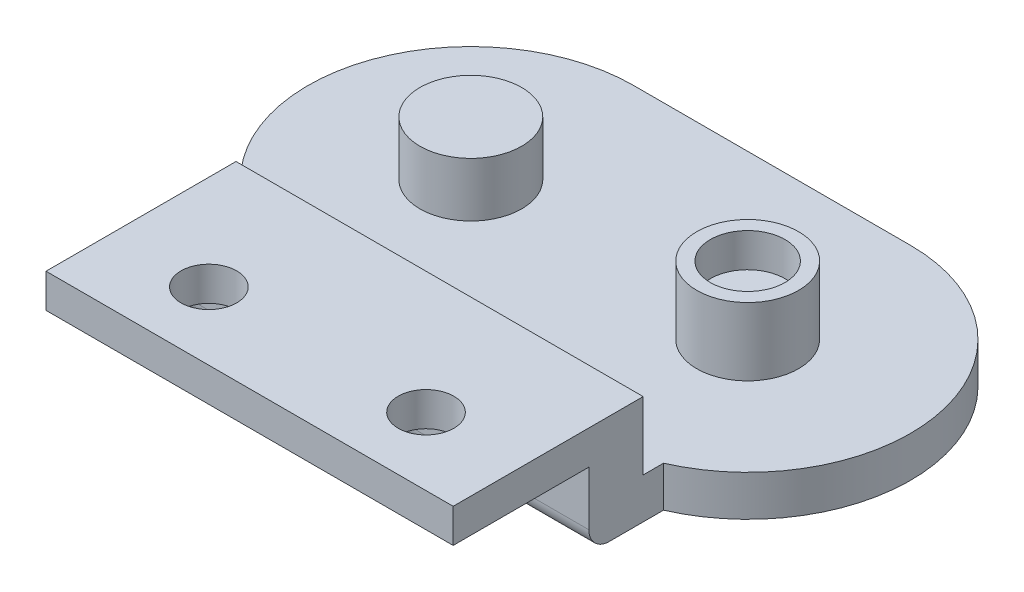
ISO-10303-21;
HEADER;
FILE_DESCRIPTION(('STEP AP214'),'2;1');
FILE_NAME('part.step','',(''),(''),'','','');
FILE_SCHEMA(('AUTOMOTIVE_DESIGN { 1 0 10303 214 1 1 1 1 }'));
ENDSEC;
DATA;
#1=APPLICATION_CONTEXT('core data for automotive mechanical design processes');
#2=APPLICATION_PROTOCOL_DEFINITION('international standard','automotive_design',2000,#1);
#3=PRODUCT_CONTEXT('',#1,'mechanical');
#4=PRODUCT('Part','Part','',(#3));
#5=PRODUCT_RELATED_PRODUCT_CATEGORY('part','',(#4));
#6=PRODUCT_DEFINITION_FORMATION('','',#4);
#7=PRODUCT_DEFINITION_CONTEXT('part definition',#1,'design');
#8=PRODUCT_DEFINITION('design','',#6,#7);
#9=PRODUCT_DEFINITION_SHAPE('','',#8);
#10=(LENGTH_UNIT() NAMED_UNIT(*) SI_UNIT(.MILLI.,.METRE.));
#11=(NAMED_UNIT(*) PLANE_ANGLE_UNIT() SI_UNIT($,.RADIAN.));
#12=(NAMED_UNIT(*) SI_UNIT($,.STERADIAN.) SOLID_ANGLE_UNIT());
#13=UNCERTAINTY_MEASURE_WITH_UNIT(LENGTH_MEASURE(1.E-05),#10,'distance_accuracy_value','');
#14=(GEOMETRIC_REPRESENTATION_CONTEXT(3) GLOBAL_UNCERTAINTY_ASSIGNED_CONTEXT((#13)) GLOBAL_UNIT_ASSIGNED_CONTEXT((#10,
#11,#12)) REPRESENTATION_CONTEXT('',''));
#15=CARTESIAN_POINT('',(0.,0.,0.));
#16=DIRECTION('',(0.,0.,1.));
#17=DIRECTION('',(1.,0.,0.));
#18=AXIS2_PLACEMENT_3D('',#15,#16,#17);
#19=CARTESIAN_POINT('',(0.,8.,0.));
#20=DIRECTION('',(0.,1.,0.));
#21=DIRECTION('',(0.,0.,1.));
#22=AXIS2_PLACEMENT_3D('',#19,#20,#21);
#23=PLANE('',#22);
#24=DIRECTION('',(1.,0.,0.));
#25=VECTOR('',#24,1.);
#26=CARTESIAN_POINT('',(0.,8.,12.5));
#27=LINE('',#26,#25);
#28=CARTESIAN_POINT('',(-15.,8.,12.5));
#29=VERTEX_POINT('',#28);
#30=CARTESIAN_POINT('',(15.,8.,12.5));
#31=VERTEX_POINT('',#30);
#32=EDGE_CURVE('E148',#29,#31,#27,.T.);
#33=ORIENTED_EDGE('',*,*,#32,.F.);
#34=DIRECTION('',(0.,0.,1.));
#35=VECTOR('',#34,1.);
#36=CARTESIAN_POINT('',(-15.,8.,0.));
#37=LINE('',#36,#35);
#38=CARTESIAN_POINT('',(-15.,8.,26.5));
#39=VERTEX_POINT('',#38);
#40=EDGE_CURVE('E155',#29,#39,#37,.T.);
#41=ORIENTED_EDGE('',*,*,#40,.T.);
#42=DIRECTION('',(-1.,0.,0.));
#43=VECTOR('',#42,1.);
#44=CARTESIAN_POINT('',(0.,8.,26.5));
#45=LINE('',#44,#43);
#46=CARTESIAN_POINT('',(15.,8.,26.5));
#47=VERTEX_POINT('',#46);
#48=EDGE_CURVE('E136',#47,#39,#45,.T.);
#49=ORIENTED_EDGE('',*,*,#48,.F.);
#50=DIRECTION('',(0.,0.,-1.));
#51=VECTOR('',#50,1.);
#52=CARTESIAN_POINT('',(15.,8.,0.));
#53=LINE('',#52,#51);
#54=EDGE_CURVE('E157',#47,#31,#53,.T.);
#55=ORIENTED_EDGE('',*,*,#54,.T.);
#56=EDGE_LOOP('',(#33,#41,#49,#55));
#57=FACE_BOUND('',#56,.T.);
#58=CARTESIAN_POINT('',(-8.,8.,21.5));
#59=DIRECTION('',(0.,1.,0.));
#60=DIRECTION('',(0.,0.,1.));
#61=AXIS2_PLACEMENT_3D('',#58,#59,#60);
#62=CIRCLE('',#61,2.05);
#63=CARTESIAN_POINT('',(-8.,8.,23.55));
#64=VERTEX_POINT('',#63);
#65=EDGE_CURVE('E228',#64,#64,#62,.T.);
#66=ORIENTED_EDGE('',*,*,#65,.F.);
#67=EDGE_LOOP('',(#66));
#68=FACE_BOUND('',#67,.T.);
#69=CARTESIAN_POINT('',(8.,8.,21.5));
#70=DIRECTION('',(0.,1.,0.));
#71=DIRECTION('',(0.,0.,1.));
#72=AXIS2_PLACEMENT_3D('',#69,#70,#71);
#73=CIRCLE('',#72,2.05);
#74=CARTESIAN_POINT('',(8.,8.,23.55));
#75=VERTEX_POINT('',#74);
#76=EDGE_CURVE('E213',#75,#75,#73,.F.);
#77=ORIENTED_EDGE('',*,*,#76,.T.);
#78=EDGE_LOOP('',(#77));
#79=FACE_BOUND('',#78,.T.);
#80=ADVANCED_FACE('F36',(#57,#68,#79),#23,.T.);
#81=CARTESIAN_POINT('',(0.,5.5,26.5));
#82=DIRECTION('',(0.,1.,0.));
#83=DIRECTION('',(0.,0.,1.));
#84=AXIS2_PLACEMENT_3D('',#81,#82,#83);
#85=PLANE('',#84);
#86=CARTESIAN_POINT('',(-8.,5.5,21.5));
#87=DIRECTION('',(0.,1.,0.));
#88=DIRECTION('',(0.,0.,1.));
#89=AXIS2_PLACEMENT_3D('',#86,#87,#88);
#90=CIRCLE('',#89,2.05);
#91=CARTESIAN_POINT('',(-8.,5.5,23.55));
#92=VERTEX_POINT('',#91);
#93=EDGE_CURVE('E209',#92,#92,#90,.T.);
#94=ORIENTED_EDGE('',*,*,#93,.T.);
#95=EDGE_LOOP('',(#94));
#96=FACE_BOUND('',#95,.T.);
#97=DIRECTION('',(1.,0.,0.));
#98=VECTOR('',#97,1.);
#99=CARTESIAN_POINT('',(0.,5.5,16.5));
#100=LINE('',#99,#98);
#101=CARTESIAN_POINT('',(-15.,5.5,16.5));
#102=VERTEX_POINT('',#101);
#103=CARTESIAN_POINT('',(15.,5.5,16.5));
#104=VERTEX_POINT('',#103);
#105=EDGE_CURVE('E139',#102,#104,#100,.T.);
#106=ORIENTED_EDGE('',*,*,#105,.T.);
#107=DIRECTION('',(0.,0.,-1.));
#108=VECTOR('',#107,1.);
#109=CARTESIAN_POINT('',(15.,5.5,26.5));
#110=LINE('',#109,#108);
#111=CARTESIAN_POINT('',(15.,5.5,26.5));
#112=VERTEX_POINT('',#111);
#113=EDGE_CURVE('E125',#112,#104,#110,.T.);
#114=ORIENTED_EDGE('',*,*,#113,.F.);
#115=DIRECTION('',(1.,0.,0.));
#116=VECTOR('',#115,1.);
#117=CARTESIAN_POINT('',(0.,5.5,26.5));
#118=LINE('',#117,#116);
#119=CARTESIAN_POINT('',(-15.,5.5,26.5));
#120=VERTEX_POINT('',#119);
#121=EDGE_CURVE('E117',#120,#112,#118,.T.);
#122=ORIENTED_EDGE('',*,*,#121,.F.);
#123=DIRECTION('',(0.,0.,-1.));
#124=VECTOR('',#123,1.);
#125=CARTESIAN_POINT('',(-15.,5.5,26.5));
#126=LINE('',#125,#124);
#127=EDGE_CURVE('E123',#120,#102,#126,.T.);
#128=ORIENTED_EDGE('',*,*,#127,.T.);
#129=EDGE_LOOP('',(#106,#114,#122,#128));
#130=FACE_BOUND('',#129,.T.);
#131=CARTESIAN_POINT('',(8.,5.5,21.5));
#132=DIRECTION('',(0.,1.,0.));
#133=DIRECTION('',(0.,0.,1.));
#134=AXIS2_PLACEMENT_3D('',#131,#132,#133);
#135=CIRCLE('',#134,2.05);
#136=CARTESIAN_POINT('',(8.,5.5,23.55));
#137=VERTEX_POINT('',#136);
#138=EDGE_CURVE('E212',#137,#137,#135,.F.);
#139=ORIENTED_EDGE('',*,*,#138,.F.);
#140=EDGE_LOOP('',(#139));
#141=FACE_BOUND('',#140,.T.);
#142=ADVANCED_FACE('F120',(#96,#130,#141),#85,.F.);
#143=CARTESIAN_POINT('',(-15.,3.,16.5));
#144=DIRECTION('',(0.,0.,-1.));
#145=DIRECTION('',(-1.,0.,0.));
#146=AXIS2_PLACEMENT_3D('',#143,#144,#145);
#147=PLANE('',#146);
#148=DIRECTION('',(0.,-1.,0.));
#149=VECTOR('',#148,1.);
#150=CARTESIAN_POINT('',(-15.,3.,16.5));
#151=LINE('',#150,#149);
#152=CARTESIAN_POINT('',(-15.,1.5,16.5));
#153=VERTEX_POINT('',#152);
#154=EDGE_CURVE('E144',#102,#153,#151,.T.);
#155=ORIENTED_EDGE('',*,*,#154,.T.);
#156=DIRECTION('',(1.,0.,0.));
#157=VECTOR('',#156,1.);
#158=CARTESIAN_POINT('',(-15.,1.5,16.5));
#159=LINE('',#158,#157);
#160=CARTESIAN_POINT('',(15.,1.5,16.5));
#161=VERTEX_POINT('',#160);
#162=EDGE_CURVE('E208',#153,#161,#159,.T.);
#163=ORIENTED_EDGE('',*,*,#162,.T.);
#164=DIRECTION('',(0.,-1.,0.));
#165=VECTOR('',#164,1.);
#166=CARTESIAN_POINT('',(15.,3.,16.5));
#167=LINE('',#166,#165);
#168=EDGE_CURVE('E202',#104,#161,#167,.T.);
#169=ORIENTED_EDGE('',*,*,#168,.F.);
#170=ORIENTED_EDGE('',*,*,#105,.F.);
#171=EDGE_LOOP('',(#155,#163,#169,#170));
#172=FACE_BOUND('',#171,.T.);
#173=ADVANCED_FACE('F220',(#172),#147,.F.);
#174=CARTESIAN_POINT('',(-10.2,3.,0.));
#175=DIRECTION('',(0.,-1.,0.));
#176=DIRECTION('',(0.,0.,-1.));
#177=AXIS2_PLACEMENT_3D('',#174,#175,#176);
#178=CYLINDRICAL_SURFACE('',#177,12.);
#179=CARTESIAN_POINT('',(-10.2,0.,0.));
#180=DIRECTION('',(0.,1.,0.));
#181=DIRECTION('',(0.,0.,1.));
#182=AXIS2_PLACEMENT_3D('',#179,#180,#181);
#183=CIRCLE('',#182,12.);
#184=CARTESIAN_POINT('',(-10.2,0.,-12.));
#185=VERTEX_POINT('',#184);
#186=CARTESIAN_POINT('',(-15.,0.,10.998181667894));
#187=VERTEX_POINT('',#186);
#188=EDGE_CURVE('E169',#185,#187,#183,.T.);
#189=ORIENTED_EDGE('',*,*,#188,.T.);
#190=DIRECTION('',(0.,-1.,0.));
#191=VECTOR('',#190,1.);
#192=CARTESIAN_POINT('',(-15.,3.,10.998181667894));
#193=LINE('',#192,#191);
#194=CARTESIAN_POINT('',(-15.,3.,10.998181667894));
#195=VERTEX_POINT('',#194);
#196=EDGE_CURVE('E205',#195,#187,#193,.T.);
#197=ORIENTED_EDGE('',*,*,#196,.F.);
#198=CARTESIAN_POINT('',(-10.2,3.,0.));
#199=DIRECTION('',(0.,1.,0.));
#200=DIRECTION('',(0.,0.,1.));
#201=AXIS2_PLACEMENT_3D('',#198,#199,#200);
#202=CIRCLE('',#201,12.);
#203=CARTESIAN_POINT('',(-10.2,3.,-12.));
#204=VERTEX_POINT('',#203);
#205=EDGE_CURVE('E172',#204,#195,#202,.T.);
#206=ORIENTED_EDGE('',*,*,#205,.F.);
#207=DIRECTION('',(0.,-1.,0.));
#208=VECTOR('',#207,1.);
#209=CARTESIAN_POINT('',(-10.2,3.,-12.));
#210=LINE('',#209,#208);
#211=EDGE_CURVE('E184',#204,#185,#210,.T.);
#212=ORIENTED_EDGE('',*,*,#211,.T.);
#213=EDGE_LOOP('',(#189,#197,#206,#212));
#214=FACE_BOUND('',#213,.T.);
#215=ADVANCED_FACE('F312',(#214),#178,.T.);
#216=CARTESIAN_POINT('',(-15.,3.,10.998181667894));
#217=DIRECTION('',(1.,0.,0.));
#218=DIRECTION('',(0.,0.,-1.));
#219=AXIS2_PLACEMENT_3D('',#216,#217,#218);
#220=PLANE('',#219);
#221=DIRECTION('',(0.,0.,1.));
#222=VECTOR('',#221,1.);
#223=CARTESIAN_POINT('',(-15.,0.,10.998181667894));
#224=LINE('',#223,#222);
#225=CARTESIAN_POINT('',(-15.,0.,15.));
#226=VERTEX_POINT('',#225);
#227=EDGE_CURVE('E187',#187,#226,#224,.T.);
#228=ORIENTED_EDGE('',*,*,#227,.T.);
#229=CARTESIAN_POINT('',(-15.,1.5,15.));
#230=DIRECTION('',(1.,0.,0.));
#231=DIRECTION('',(0.,0.,-1.));
#232=AXIS2_PLACEMENT_3D('',#229,#230,#231);
#233=CIRCLE('',#232,1.5);
#234=EDGE_CURVE('E11',#226,#153,#233,.F.);
#235=ORIENTED_EDGE('',*,*,#234,.T.);
#236=ORIENTED_EDGE('',*,*,#154,.F.);
#237=ORIENTED_EDGE('',*,*,#127,.F.);
#238=DIRECTION('',(0.,-1.,0.));
#239=VECTOR('',#238,1.);
#240=CARTESIAN_POINT('',(-15.,0.,26.5));
#241=LINE('',#240,#239);
#242=EDGE_CURVE('E130',#39,#120,#241,.T.);
#243=ORIENTED_EDGE('',*,*,#242,.F.);
#244=ORIENTED_EDGE('',*,*,#40,.F.);
#245=DIRECTION('',(0.,-1.,0.));
#246=VECTOR('',#245,1.);
#247=CARTESIAN_POINT('',(-15.,8.,12.5));
#248=LINE('',#247,#246);
#249=CARTESIAN_POINT('',(-15.,3.,12.5));
#250=VERTEX_POINT('',#249);
#251=EDGE_CURVE('E162',#29,#250,#248,.T.);
#252=ORIENTED_EDGE('',*,*,#251,.T.);
#253=DIRECTION('',(0.,0.,1.));
#254=VECTOR('',#253,1.);
#255=CARTESIAN_POINT('',(-15.,3.,10.998181667894));
#256=LINE('',#255,#254);
#257=EDGE_CURVE('E175',#195,#250,#256,.T.);
#258=ORIENTED_EDGE('',*,*,#257,.F.);
#259=ORIENTED_EDGE('',*,*,#196,.T.);
#260=EDGE_LOOP('',(#228,#235,#236,#237,#243,#244,#252,#258,#259));
#261=FACE_BOUND('',#260,.T.);
#262=ADVANCED_FACE('F142',(#261),#220,.F.);
#263=CARTESIAN_POINT('',(15.,3.,10.998181667894));
#264=DIRECTION('',(-1.,0.,0.));
#265=DIRECTION('',(0.,0.,1.));
#266=AXIS2_PLACEMENT_3D('',#263,#264,#265);
#267=PLANE('',#266);
#268=ORIENTED_EDGE('',*,*,#168,.T.);
#269=CARTESIAN_POINT('',(15.,1.5,15.));
#270=DIRECTION('',(-1.,0.,0.));
#271=DIRECTION('',(0.,0.,1.));
#272=AXIS2_PLACEMENT_3D('',#269,#270,#271);
#273=CIRCLE('',#272,1.5);
#274=CARTESIAN_POINT('',(15.,0.,15.));
#275=VERTEX_POINT('',#274);
#276=EDGE_CURVE('E58',#161,#275,#273,.F.);
#277=ORIENTED_EDGE('',*,*,#276,.T.);
#278=DIRECTION('',(0.,0.,-1.));
#279=VECTOR('',#278,1.);
#280=CARTESIAN_POINT('',(15.,0.,10.998181667894));
#281=LINE('',#280,#279);
#282=CARTESIAN_POINT('',(15.,0.,10.998181667894));
#283=VERTEX_POINT('',#282);
#284=EDGE_CURVE('E189',#275,#283,#281,.T.);
#285=ORIENTED_EDGE('',*,*,#284,.T.);
#286=DIRECTION('',(0.,-1.,0.));
#287=VECTOR('',#286,1.);
#288=CARTESIAN_POINT('',(15.,3.,10.998181667894));
#289=LINE('',#288,#287);
#290=CARTESIAN_POINT('',(15.,3.,10.998181667894));
#291=VERTEX_POINT('',#290);
#292=EDGE_CURVE('E199',#291,#283,#289,.T.);
#293=ORIENTED_EDGE('',*,*,#292,.F.);
#294=DIRECTION('',(0.,0.,-1.));
#295=VECTOR('',#294,1.);
#296=CARTESIAN_POINT('',(15.,3.,10.998181667894));
#297=LINE('',#296,#295);
#298=CARTESIAN_POINT('',(15.,3.,12.5));
#299=VERTEX_POINT('',#298);
#300=EDGE_CURVE('E178',#299,#291,#297,.T.);
#301=ORIENTED_EDGE('',*,*,#300,.F.);
#302=DIRECTION('',(0.,-1.,0.));
#303=VECTOR('',#302,1.);
#304=CARTESIAN_POINT('',(15.,8.,12.5));
#305=LINE('',#304,#303);
#306=EDGE_CURVE('E158',#31,#299,#305,.T.);
#307=ORIENTED_EDGE('',*,*,#306,.F.);
#308=ORIENTED_EDGE('',*,*,#54,.F.);
#309=DIRECTION('',(0.,1.,0.));
#310=VECTOR('',#309,1.);
#311=CARTESIAN_POINT('',(15.,0.,26.5));
#312=LINE('',#311,#310);
#313=EDGE_CURVE('E129',#112,#47,#312,.T.);
#314=ORIENTED_EDGE('',*,*,#313,.F.);
#315=ORIENTED_EDGE('',*,*,#113,.T.);
#316=EDGE_LOOP('',(#268,#277,#285,#293,#301,#307,#308,#314,#315));
#317=FACE_BOUND('',#316,.T.);
#318=ADVANCED_FACE('F223',(#317),#267,.F.);
#319=CARTESIAN_POINT('',(10.2,3.,0.));
#320=DIRECTION('',(0.,-1.,0.));
#321=DIRECTION('',(0.,0.,-1.));
#322=AXIS2_PLACEMENT_3D('',#319,#320,#321);
#323=CYLINDRICAL_SURFACE('',#322,12.);
#324=CARTESIAN_POINT('',(10.2,0.,0.));
#325=DIRECTION('',(0.,1.,0.));
#326=DIRECTION('',(0.,0.,-1.));
#327=AXIS2_PLACEMENT_3D('',#324,#325,#326);
#328=CIRCLE('',#327,12.);
#329=CARTESIAN_POINT('',(10.2,0.,-12.));
#330=VERTEX_POINT('',#329);
#331=EDGE_CURVE('E191',#283,#330,#328,.T.);
#332=ORIENTED_EDGE('',*,*,#331,.T.);
#333=DIRECTION('',(0.,-1.,0.));
#334=VECTOR('',#333,1.);
#335=CARTESIAN_POINT('',(10.2,3.,-12.));
#336=LINE('',#335,#334);
#337=CARTESIAN_POINT('',(10.2,3.,-12.));
#338=VERTEX_POINT('',#337);
#339=EDGE_CURVE('E196',#338,#330,#336,.T.);
#340=ORIENTED_EDGE('',*,*,#339,.F.);
#341=CARTESIAN_POINT('',(10.2,3.,0.));
#342=DIRECTION('',(0.,1.,0.));
#343=DIRECTION('',(0.,0.,-1.));
#344=AXIS2_PLACEMENT_3D('',#341,#342,#343);
#345=CIRCLE('',#344,12.);
#346=EDGE_CURVE('E180',#291,#338,#345,.T.);
#347=ORIENTED_EDGE('',*,*,#346,.F.);
#348=ORIENTED_EDGE('',*,*,#292,.T.);
#349=EDGE_LOOP('',(#332,#340,#347,#348));
#350=FACE_BOUND('',#349,.T.);
#351=ADVANCED_FACE('F304',(#350),#323,.T.);
#352=CARTESIAN_POINT('',(-10.2,3.,-12.));
#353=DIRECTION('',(0.,0.,1.));
#354=DIRECTION('',(1.,0.,0.));
#355=AXIS2_PLACEMENT_3D('',#352,#353,#354);
#356=PLANE('',#355);
#357=DIRECTION('',(-1.,0.,0.));
#358=VECTOR('',#357,1.);
#359=CARTESIAN_POINT('',(-10.2,0.,-12.));
#360=LINE('',#359,#358);
#361=EDGE_CURVE('E176',#330,#185,#360,.T.);
#362=ORIENTED_EDGE('',*,*,#361,.T.);
#363=ORIENTED_EDGE('',*,*,#211,.F.);
#364=DIRECTION('',(-1.,0.,0.));
#365=VECTOR('',#364,1.);
#366=CARTESIAN_POINT('',(-10.2,3.,-12.));
#367=LINE('',#366,#365);
#368=EDGE_CURVE('E182',#338,#204,#367,.T.);
#369=ORIENTED_EDGE('',*,*,#368,.F.);
#370=ORIENTED_EDGE('',*,*,#339,.T.);
#371=EDGE_LOOP('',(#362,#363,#369,#370));
#372=FACE_BOUND('',#371,.T.);
#373=ADVANCED_FACE('F259',(#372),#356,.F.);
#374=CARTESIAN_POINT('',(-10.2,3.,0.));
#375=DIRECTION('',(0.,1.,0.));
#376=DIRECTION('',(0.,0.,1.));
#377=AXIS2_PLACEMENT_3D('',#374,#375,#376);
#378=PLANE('',#377);
#379=CARTESIAN_POINT('',(-10.2,3.,0.));
#380=DIRECTION('',(0.,1.,0.));
#381=DIRECTION('',(0.,0.,1.));
#382=AXIS2_PLACEMENT_3D('',#379,#380,#381);
#383=CIRCLE('',#382,3.75);
#384=CARTESIAN_POINT('',(-10.2,3.,3.75));
#385=VERTEX_POINT('',#384);
#386=EDGE_CURVE('E240',#385,#385,#383,.T.);
#387=ORIENTED_EDGE('',*,*,#386,.F.);
#388=EDGE_LOOP('',(#387));
#389=FACE_BOUND('',#388,.T.);
#390=DIRECTION('',(1.,0.,0.));
#391=VECTOR('',#390,1.);
#392=CARTESIAN_POINT('',(0.,3.,12.5));
#393=LINE('',#392,#391);
#394=EDGE_CURVE('E145',#250,#299,#393,.T.);
#395=ORIENTED_EDGE('',*,*,#394,.T.);
#396=ORIENTED_EDGE('',*,*,#300,.T.);
#397=ORIENTED_EDGE('',*,*,#346,.T.);
#398=ORIENTED_EDGE('',*,*,#368,.T.);
#399=ORIENTED_EDGE('',*,*,#205,.T.);
#400=ORIENTED_EDGE('',*,*,#257,.T.);
#401=EDGE_LOOP('',(#395,#396,#397,#398,#399,#400));
#402=FACE_BOUND('',#401,.T.);
#403=CARTESIAN_POINT('',(10.2,3.,0.));
#404=DIRECTION('',(0.,1.,0.));
#405=DIRECTION('',(0.,0.,1.));
#406=AXIS2_PLACEMENT_3D('',#403,#404,#405);
#407=CIRCLE('',#406,3.75);
#408=CARTESIAN_POINT('',(10.2,3.,3.75));
#409=VERTEX_POINT('',#408);
#410=EDGE_CURVE('E165',#409,#409,#407,.T.);
#411=ORIENTED_EDGE('',*,*,#410,.F.);
#412=EDGE_LOOP('',(#411));
#413=FACE_BOUND('',#412,.T.);
#414=ADVANCED_FACE('F255',(#389,#402,#413),#378,.T.);
#415=CARTESIAN_POINT('',(-10.2,0.,0.));
#416=DIRECTION('',(0.,1.,0.));
#417=DIRECTION('',(0.,0.,1.));
#418=AXIS2_PLACEMENT_3D('',#415,#416,#417);
#419=PLANE('',#418);
#420=ORIENTED_EDGE('',*,*,#284,.F.);
#421=DIRECTION('',(1.,0.,0.));
#422=VECTOR('',#421,1.);
#423=CARTESIAN_POINT('',(-10.2,0.,15.));
#424=LINE('',#423,#422);
#425=EDGE_CURVE('E44',#275,#226,#424,.F.);
#426=ORIENTED_EDGE('',*,*,#425,.T.);
#427=ORIENTED_EDGE('',*,*,#227,.F.);
#428=ORIENTED_EDGE('',*,*,#188,.F.);
#429=ORIENTED_EDGE('',*,*,#361,.F.);
#430=ORIENTED_EDGE('',*,*,#331,.F.);
#431=EDGE_LOOP('',(#420,#426,#427,#428,#429,#430));
#432=FACE_BOUND('',#431,.T.);
#433=ADVANCED_FACE('F258',(#432),#419,.F.);
#434=CARTESIAN_POINT('',(10.2,8.,0.));
#435=DIRECTION('',(0.,-1.,0.));
#436=DIRECTION('',(0.,0.,-1.));
#437=AXIS2_PLACEMENT_3D('',#434,#435,#436);
#438=CYLINDRICAL_SURFACE('',#437,3.75);
#439=CARTESIAN_POINT('',(10.2,8.,0.));
#440=DIRECTION('',(0.,1.,0.));
#441=DIRECTION('',(0.,0.,1.));
#442=AXIS2_PLACEMENT_3D('',#439,#440,#441);
#443=CIRCLE('',#442,3.75);
#444=CARTESIAN_POINT('',(10.2,8.,3.75));
#445=VERTEX_POINT('',#444);
#446=EDGE_CURVE('E166',#445,#445,#443,.T.);
#447=ORIENTED_EDGE('',*,*,#446,.F.);
#448=EDGE_LOOP('',(#447));
#449=FACE_BOUND('',#448,.T.);
#450=ORIENTED_EDGE('',*,*,#410,.T.);
#451=EDGE_LOOP('',(#450));
#452=FACE_BOUND('',#451,.T.);
#453=ADVANCED_FACE('F265',(#449,#452),#438,.T.);
#454=CARTESIAN_POINT('',(10.2,8.,0.));
#455=DIRECTION('',(0.,1.,0.));
#456=DIRECTION('',(0.,0.,1.));
#457=AXIS2_PLACEMENT_3D('',#454,#455,#456);
#458=PLANE('',#457);
#459=CARTESIAN_POINT('',(10.2,8.,0.));
#460=DIRECTION('',(0.,1.,0.));
#461=DIRECTION('',(0.,0.,1.));
#462=AXIS2_PLACEMENT_3D('',#459,#460,#461);
#463=CIRCLE('',#462,2.75);
#464=CARTESIAN_POINT('',(10.2,8.,2.75));
#465=VERTEX_POINT('',#464);
#466=EDGE_CURVE('E234',#465,#465,#463,.T.);
#467=ORIENTED_EDGE('',*,*,#466,.F.);
#468=EDGE_LOOP('',(#467));
#469=FACE_BOUND('',#468,.T.);
#470=ORIENTED_EDGE('',*,*,#446,.T.);
#471=EDGE_LOOP('',(#470));
#472=FACE_BOUND('',#471,.T.);
#473=ADVANCED_FACE('F267',(#469,#472),#458,.T.);
#474=CARTESIAN_POINT('',(0.,8.,12.5));
#475=DIRECTION('',(0.,0.,-1.));
#476=DIRECTION('',(-1.,0.,0.));
#477=AXIS2_PLACEMENT_3D('',#474,#475,#476);
#478=PLANE('',#477);
#479=ORIENTED_EDGE('',*,*,#394,.F.);
#480=ORIENTED_EDGE('',*,*,#251,.F.);
#481=ORIENTED_EDGE('',*,*,#32,.T.);
#482=ORIENTED_EDGE('',*,*,#306,.T.);
#483=EDGE_LOOP('',(#479,#480,#481,#482));
#484=FACE_BOUND('',#483,.T.);
#485=ADVANCED_FACE('F274',(#484),#478,.T.);
#486=CARTESIAN_POINT('',(0.,0.,26.5));
#487=DIRECTION('',(0.,0.,1.));
#488=DIRECTION('',(1.,0.,0.));
#489=AXIS2_PLACEMENT_3D('',#486,#487,#488);
#490=PLANE('',#489);
#491=ORIENTED_EDGE('',*,*,#242,.T.);
#492=ORIENTED_EDGE('',*,*,#121,.T.);
#493=ORIENTED_EDGE('',*,*,#313,.T.);
#494=ORIENTED_EDGE('',*,*,#48,.T.);
#495=EDGE_LOOP('',(#491,#492,#493,#494));
#496=FACE_BOUND('',#495,.T.);
#497=ADVANCED_FACE('F134',(#496),#490,.T.);
#498=CARTESIAN_POINT('',(-8.,-2.,21.5));
#499=DIRECTION('',(0.,1.,0.));
#500=DIRECTION('',(0.,0.,1.));
#501=AXIS2_PLACEMENT_3D('',#498,#499,#500);
#502=CYLINDRICAL_SURFACE('',#501,2.05);
#503=ORIENTED_EDGE('',*,*,#65,.T.);
#504=EDGE_LOOP('',(#503));
#505=FACE_BOUND('',#504,.T.);
#506=ORIENTED_EDGE('',*,*,#93,.F.);
#507=EDGE_LOOP('',(#506));
#508=FACE_BOUND('',#507,.T.);
#509=ADVANCED_FACE('F297',(#505,#508),#502,.F.);
#510=CARTESIAN_POINT('',(8.,-2.,21.5));
#511=DIRECTION('',(0.,1.,0.));
#512=DIRECTION('',(0.,0.,1.));
#513=AXIS2_PLACEMENT_3D('',#510,#511,#512);
#514=CYLINDRICAL_SURFACE('',#513,2.05);
#515=ORIENTED_EDGE('',*,*,#76,.F.);
#516=EDGE_LOOP('',(#515));
#517=FACE_BOUND('',#516,.T.);
#518=ORIENTED_EDGE('',*,*,#138,.T.);
#519=EDGE_LOOP('',(#518));
#520=FACE_BOUND('',#519,.T.);
#521=ADVANCED_FACE('F327',(#517,#520),#514,.F.);
#522=CARTESIAN_POINT('',(10.2,5.5,0.));
#523=DIRECTION('',(0.,1.,0.));
#524=DIRECTION('',(0.,0.,1.));
#525=AXIS2_PLACEMENT_3D('',#522,#523,#524);
#526=CYLINDRICAL_SURFACE('',#525,2.75);
#527=CARTESIAN_POINT('',(10.2,5.5,0.));
#528=DIRECTION('',(0.,1.,0.));
#529=DIRECTION('',(0.,0.,1.));
#530=AXIS2_PLACEMENT_3D('',#527,#528,#529);
#531=CIRCLE('',#530,2.75);
#532=CARTESIAN_POINT('',(10.2,5.5,2.75));
#533=VERTEX_POINT('',#532);
#534=EDGE_CURVE('E231',#533,#533,#531,.T.);
#535=ORIENTED_EDGE('',*,*,#534,.F.);
#536=EDGE_LOOP('',(#535));
#537=FACE_BOUND('',#536,.T.);
#538=ORIENTED_EDGE('',*,*,#466,.T.);
#539=EDGE_LOOP('',(#538));
#540=FACE_BOUND('',#539,.T.);
#541=ADVANCED_FACE('F323',(#537,#540),#526,.F.);
#542=CARTESIAN_POINT('',(10.2,5.5,0.));
#543=DIRECTION('',(0.,1.,0.));
#544=DIRECTION('',(0.,0.,1.));
#545=AXIS2_PLACEMENT_3D('',#542,#543,#544);
#546=PLANE('',#545);
#547=ORIENTED_EDGE('',*,*,#534,.T.);
#548=EDGE_LOOP('',(#547));
#549=FACE_BOUND('',#548,.T.);
#550=ADVANCED_FACE('F251',(#549),#546,.T.);
#551=CARTESIAN_POINT('',(-10.2,7.,0.));
#552=DIRECTION('',(0.,-1.,0.));
#553=DIRECTION('',(0.,0.,-1.));
#554=AXIS2_PLACEMENT_3D('',#551,#552,#553);
#555=CYLINDRICAL_SURFACE('',#554,3.75);
#556=CARTESIAN_POINT('',(-10.2,7.,0.));
#557=DIRECTION('',(0.,1.,0.));
#558=DIRECTION('',(0.,0.,1.));
#559=AXIS2_PLACEMENT_3D('',#556,#557,#558);
#560=CIRCLE('',#559,3.75);
#561=CARTESIAN_POINT('',(-10.2,7.,3.75));
#562=VERTEX_POINT('',#561);
#563=EDGE_CURVE('E237',#562,#562,#560,.T.);
#564=ORIENTED_EDGE('',*,*,#563,.F.);
#565=EDGE_LOOP('',(#564));
#566=FACE_BOUND('',#565,.T.);
#567=ORIENTED_EDGE('',*,*,#386,.T.);
#568=EDGE_LOOP('',(#567));
#569=FACE_BOUND('',#568,.T.);
#570=ADVANCED_FACE('F248',(#566,#569),#555,.T.);
#571=CARTESIAN_POINT('',(-10.2,7.,0.));
#572=DIRECTION('',(0.,1.,0.));
#573=DIRECTION('',(0.,0.,1.));
#574=AXIS2_PLACEMENT_3D('',#571,#572,#573);
#575=PLANE('',#574);
#576=ORIENTED_EDGE('',*,*,#563,.T.);
#577=EDGE_LOOP('',(#576));
#578=FACE_BOUND('',#577,.T.);
#579=ADVANCED_FACE('F246',(#578),#575,.T.);
#580=CARTESIAN_POINT('',(-15.,1.5,15.));
#581=DIRECTION('',(1.,0.,0.));
#582=DIRECTION('',(0.,0.,-1.));
#583=AXIS2_PLACEMENT_3D('',#580,#581,#582);
#584=CYLINDRICAL_SURFACE('',#583,1.5);
#585=ORIENTED_EDGE('',*,*,#234,.F.);
#586=ORIENTED_EDGE('',*,*,#425,.F.);
#587=ORIENTED_EDGE('',*,*,#276,.F.);
#588=ORIENTED_EDGE('',*,*,#162,.F.);
#589=EDGE_LOOP('',(#585,#586,#587,#588));
#590=FACE_BOUND('',#589,.T.);
#591=ADVANCED_FACE('F38',(#590),#584,.T.);
#592=CLOSED_SHELL('',(#80,#142,#173,#215,#262,#318,#351,#373,#414,#433,#453,#473,#485,#497,#509,
#521,#541,#550,#570,#579,#591));
#593=MANIFOLD_SOLID_BREP('B2',#592);
#594=ADVANCED_BREP_SHAPE_REPRESENTATION('',(#18,#593),#14);
#595=SHAPE_DEFINITION_REPRESENTATION(#9,#594);
ENDSEC;
END-ISO-10303-21;
